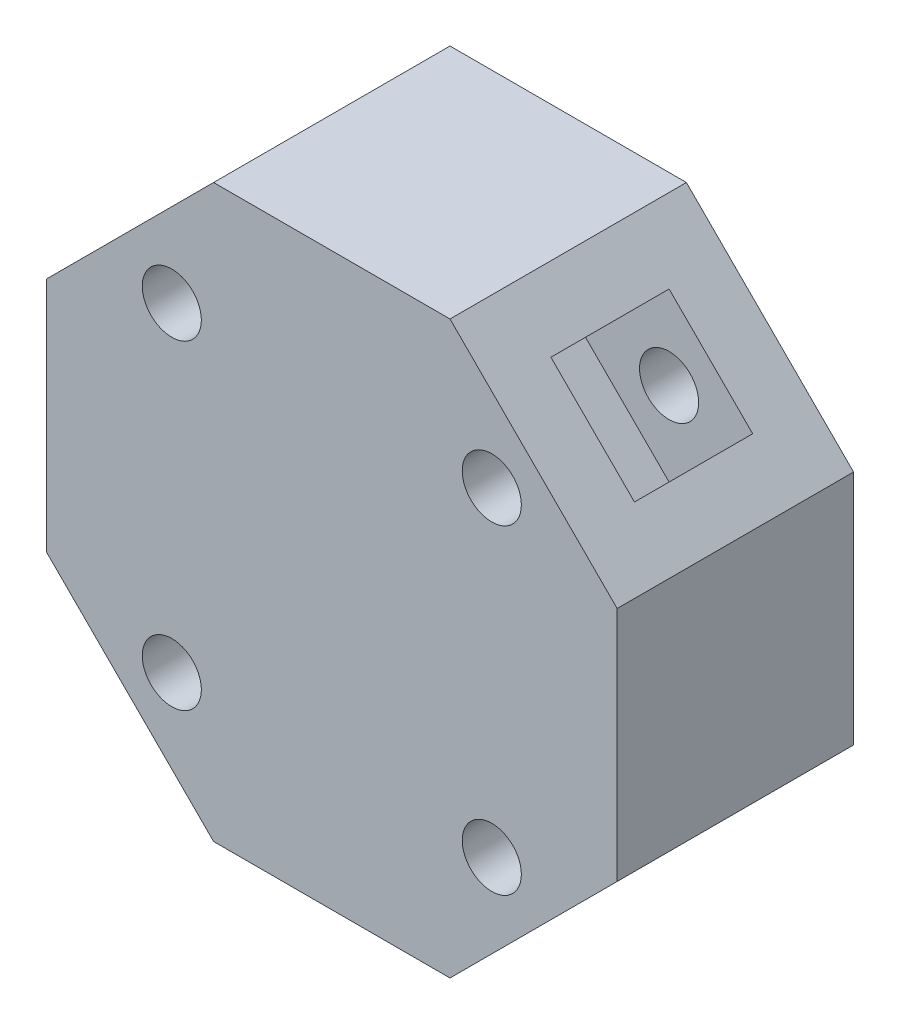
ISO-10303-21;
HEADER;
FILE_DESCRIPTION(('STEP AP214'),'2;1');
FILE_NAME('part.step','',(''),(''),'','','');
FILE_SCHEMA(('AUTOMOTIVE_DESIGN { 1 0 10303 214 1 1 1 1 }'));
ENDSEC;
DATA;
#1=APPLICATION_CONTEXT('core data for automotive mechanical design processes');
#2=APPLICATION_PROTOCOL_DEFINITION('international standard','automotive_design',2000,#1);
#3=PRODUCT_CONTEXT('',#1,'mechanical');
#4=PRODUCT('Part','Part','',(#3));
#5=PRODUCT_RELATED_PRODUCT_CATEGORY('part','',(#4));
#6=PRODUCT_DEFINITION_FORMATION('','',#4);
#7=PRODUCT_DEFINITION_CONTEXT('part definition',#1,'design');
#8=PRODUCT_DEFINITION('design','',#6,#7);
#9=PRODUCT_DEFINITION_SHAPE('','',#8);
#10=(LENGTH_UNIT() NAMED_UNIT(*) SI_UNIT(.MILLI.,.METRE.));
#11=(NAMED_UNIT(*) PLANE_ANGLE_UNIT() SI_UNIT($,.RADIAN.));
#12=(NAMED_UNIT(*) SI_UNIT($,.STERADIAN.) SOLID_ANGLE_UNIT());
#13=UNCERTAINTY_MEASURE_WITH_UNIT(LENGTH_MEASURE(1.E-05),#10,'distance_accuracy_value','');
#14=(GEOMETRIC_REPRESENTATION_CONTEXT(3) GLOBAL_UNCERTAINTY_ASSIGNED_CONTEXT((#13)) GLOBAL_UNIT_ASSIGNED_CONTEXT((#10,
#11,#12)) REPRESENTATION_CONTEXT('',''));
#15=CARTESIAN_POINT('',(0.,0.,0.));
#16=DIRECTION('',(0.,0.,1.));
#17=DIRECTION('',(1.,0.,0.));
#18=AXIS2_PLACEMENT_3D('',#15,#16,#17);
#19=CARTESIAN_POINT('',(12.7,-30.6605122421383,25.4));
#20=DIRECTION('',(-0.707106781186547,0.707106781186548,0.));
#21=DIRECTION('',(-0.707106781186548,-0.707106781186547,0.));
#22=AXIS2_PLACEMENT_3D('',#19,#20,#21);
#23=PLANE('',#22);
#24=DIRECTION('',(0.707106781186548,0.707106781186547,0.));
#25=VECTOR('',#24,1.);
#26=CARTESIAN_POINT('',(12.7,-30.6605122421383,0.));
#27=LINE('',#26,#25);
#28=CARTESIAN_POINT('',(12.7,-30.6605122421383,0.));
#29=VERTEX_POINT('',#28);
#30=CARTESIAN_POINT('',(30.6605122421383,-12.7,0.));
#31=VERTEX_POINT('',#30);
#32=EDGE_CURVE('E354',#29,#31,#27,.T.);
#33=ORIENTED_EDGE('',*,*,#32,.T.);
#34=DIRECTION('',(0.,0.,-1.));
#35=VECTOR('',#34,1.);
#36=CARTESIAN_POINT('',(30.6605122421383,-12.7,25.4));
#37=LINE('',#36,#35);
#38=CARTESIAN_POINT('',(30.6605122421383,-12.7,25.4));
#39=VERTEX_POINT('',#38);
#40=EDGE_CURVE('E379',#39,#31,#37,.T.);
#41=ORIENTED_EDGE('',*,*,#40,.F.);
#42=DIRECTION('',(0.707106781186548,0.707106781186547,0.));
#43=VECTOR('',#42,1.);
#44=CARTESIAN_POINT('',(12.7,-30.6605122421383,25.4));
#45=LINE('',#44,#43);
#46=CARTESIAN_POINT('',(12.7,-30.6605122421383,25.4));
#47=VERTEX_POINT('',#46);
#48=EDGE_CURVE('E337',#47,#39,#45,.T.);
#49=ORIENTED_EDGE('',*,*,#48,.F.);
#50=DIRECTION('',(0.,0.,-1.));
#51=VECTOR('',#50,1.);
#52=CARTESIAN_POINT('',(12.7,-30.6605122421383,25.4));
#53=LINE('',#52,#51);
#54=EDGE_CURVE('E42',#47,#29,#53,.T.);
#55=ORIENTED_EDGE('',*,*,#54,.T.);
#56=EDGE_LOOP('',(#33,#41,#49,#55));
#57=FACE_BOUND('',#56,.T.);
#58=DIRECTION('',(0.707106781186547,0.707106781186548,0.));
#59=VECTOR('',#58,1.);
#60=CARTESIAN_POINT('',(26.1703841816038,-17.1901280605346,19.05));
#61=LINE('',#60,#59);
#62=CARTESIAN_POINT('',(17.1901280605346,-26.1703841816037,19.05));
#63=VERTEX_POINT('',#62);
#64=CARTESIAN_POINT('',(26.1703841816038,-17.1901280605346,19.05));
#65=VERTEX_POINT('',#64);
#66=EDGE_CURVE('E50',#63,#65,#61,.T.);
#67=ORIENTED_EDGE('',*,*,#66,.T.);
#68=DIRECTION('',(0.,0.,-1.));
#69=VECTOR('',#68,1.);
#70=CARTESIAN_POINT('',(26.1703841816038,-17.1901280605346,6.35));
#71=LINE('',#70,#69);
#72=CARTESIAN_POINT('',(26.1703841816038,-17.1901280605346,6.35));
#73=VERTEX_POINT('',#72);
#74=EDGE_CURVE('E216',#65,#73,#71,.T.);
#75=ORIENTED_EDGE('',*,*,#74,.T.);
#76=DIRECTION('',(-0.707106781186547,-0.707106781186548,0.));
#77=VECTOR('',#76,1.);
#78=CARTESIAN_POINT('',(26.1703841816038,-17.1901280605346,6.35));
#79=LINE('',#78,#77);
#80=CARTESIAN_POINT('',(17.1901280605346,-26.1703841816038,6.35));
#81=VERTEX_POINT('',#80);
#82=EDGE_CURVE('E219',#73,#81,#79,.T.);
#83=ORIENTED_EDGE('',*,*,#82,.T.);
#84=DIRECTION('',(0.,0.,1.));
#85=VECTOR('',#84,1.);
#86=CARTESIAN_POINT('',(17.1901280605346,-26.1703841816038,6.35));
#87=LINE('',#86,#85);
#88=EDGE_CURVE('E228',#81,#63,#87,.T.);
#89=ORIENTED_EDGE('',*,*,#88,.T.);
#90=EDGE_LOOP('',(#67,#75,#83,#89));
#91=FACE_BOUND('',#90,.T.);
#92=ADVANCED_FACE('F33',(#57,#91),#23,.F.);
#93=CARTESIAN_POINT('',(-12.7,30.6605122421383,25.4));
#94=DIRECTION('',(0.707106781186547,-0.707106781186548,0.));
#95=DIRECTION('',(0.707106781186548,0.707106781186547,0.));
#96=AXIS2_PLACEMENT_3D('',#93,#94,#95);
#97=PLANE('',#96);
#98=DIRECTION('',(-0.707106781186548,-0.707106781186547,0.));
#99=VECTOR('',#98,1.);
#100=CARTESIAN_POINT('',(-12.7,30.6605122421383,0.));
#101=LINE('',#100,#99);
#102=CARTESIAN_POINT('',(-12.7,30.6605122421383,0.));
#103=VERTEX_POINT('',#102);
#104=CARTESIAN_POINT('',(-30.6605122421383,12.7,0.));
#105=VERTEX_POINT('',#104);
#106=EDGE_CURVE('E362',#103,#105,#101,.T.);
#107=ORIENTED_EDGE('',*,*,#106,.T.);
#108=DIRECTION('',(0.,0.,-1.));
#109=VECTOR('',#108,1.);
#110=CARTESIAN_POINT('',(-30.6605122421383,12.7,25.4));
#111=LINE('',#110,#109);
#112=CARTESIAN_POINT('',(-30.6605122421383,12.7,25.4));
#113=VERTEX_POINT('',#112);
#114=EDGE_CURVE('E367',#113,#105,#111,.T.);
#115=ORIENTED_EDGE('',*,*,#114,.F.);
#116=DIRECTION('',(-0.707106781186548,-0.707106781186547,0.));
#117=VECTOR('',#116,1.);
#118=CARTESIAN_POINT('',(-12.7,30.6605122421383,25.4));
#119=LINE('',#118,#117);
#120=CARTESIAN_POINT('',(-12.7,30.6605122421383,25.4));
#121=VERTEX_POINT('',#120);
#122=EDGE_CURVE('E345',#121,#113,#119,.T.);
#123=ORIENTED_EDGE('',*,*,#122,.F.);
#124=DIRECTION('',(0.,0.,-1.));
#125=VECTOR('',#124,1.);
#126=CARTESIAN_POINT('',(-12.7,30.6605122421383,25.4));
#127=LINE('',#126,#125);
#128=EDGE_CURVE('E370',#121,#103,#127,.T.);
#129=ORIENTED_EDGE('',*,*,#128,.T.);
#130=EDGE_LOOP('',(#107,#115,#123,#129));
#131=FACE_BOUND('',#130,.T.);
#132=DIRECTION('',(-0.707106781186548,-0.707106781186547,0.));
#133=VECTOR('',#132,1.);
#134=CARTESIAN_POINT('',(-26.1703841816038,17.1901280605346,19.05));
#135=LINE('',#134,#133);
#136=CARTESIAN_POINT('',(-17.1901280605346,26.1703841816038,19.05));
#137=VERTEX_POINT('',#136);
#138=CARTESIAN_POINT('',(-26.1703841816038,17.1901280605346,19.05));
#139=VERTEX_POINT('',#138);
#140=EDGE_CURVE('E262',#137,#139,#135,.T.);
#141=ORIENTED_EDGE('',*,*,#140,.T.);
#142=DIRECTION('',(0.,0.,-1.));
#143=VECTOR('',#142,1.);
#144=CARTESIAN_POINT('',(-26.1703841816038,17.1901280605346,6.35));
#145=LINE('',#144,#143);
#146=CARTESIAN_POINT('',(-26.1703841816038,17.1901280605346,6.35));
#147=VERTEX_POINT('',#146);
#148=EDGE_CURVE('E272',#139,#147,#145,.T.);
#149=ORIENTED_EDGE('',*,*,#148,.T.);
#150=DIRECTION('',(0.707106781186548,0.707106781186547,0.));
#151=VECTOR('',#150,1.);
#152=CARTESIAN_POINT('',(-26.1703841816038,17.1901280605346,6.35));
#153=LINE('',#152,#151);
#154=CARTESIAN_POINT('',(-17.1901280605346,26.1703841816038,6.35));
#155=VERTEX_POINT('',#154);
#156=EDGE_CURVE('E284',#147,#155,#153,.T.);
#157=ORIENTED_EDGE('',*,*,#156,.T.);
#158=DIRECTION('',(0.,0.,1.));
#159=VECTOR('',#158,1.);
#160=CARTESIAN_POINT('',(-17.1901280605346,26.1703841816038,6.35));
#161=LINE('',#160,#159);
#162=EDGE_CURVE('E281',#155,#137,#161,.T.);
#163=ORIENTED_EDGE('',*,*,#162,.T.);
#164=EDGE_LOOP('',(#141,#149,#157,#163));
#165=FACE_BOUND('',#164,.T.);
#166=ADVANCED_FACE('F464',(#131,#165),#97,.F.);
#167=CARTESIAN_POINT('',(-30.6605122421384,-12.7,25.4));
#168=DIRECTION('',(0.707106781186548,0.707106781186547,0.));
#169=DIRECTION('',(-0.707106781186547,0.707106781186548,0.));
#170=AXIS2_PLACEMENT_3D('',#167,#168,#169);
#171=PLANE('',#170);
#172=DIRECTION('',(0.,0.,-1.));
#173=VECTOR('',#172,1.);
#174=CARTESIAN_POINT('',(-26.1703841816038,-17.1901280605346,6.35));
#175=LINE('',#174,#173);
#176=CARTESIAN_POINT('',(-26.1703841816037,-17.1901280605346,19.05));
#177=VERTEX_POINT('',#176);
#178=CARTESIAN_POINT('',(-26.1703841816038,-17.1901280605346,6.35));
#179=VERTEX_POINT('',#178);
#180=EDGE_CURVE('E252',#177,#179,#175,.T.);
#181=ORIENTED_EDGE('',*,*,#180,.F.);
#182=DIRECTION('',(-0.707106781186548,0.707106781186547,0.));
#183=VECTOR('',#182,1.);
#184=CARTESIAN_POINT('',(-26.1703841816038,-17.1901280605346,19.05));
#185=LINE('',#184,#183);
#186=CARTESIAN_POINT('',(-17.1901280605346,-26.1703841816038,19.05));
#187=VERTEX_POINT('',#186);
#188=EDGE_CURVE('E58',#187,#177,#185,.T.);
#189=ORIENTED_EDGE('',*,*,#188,.F.);
#190=DIRECTION('',(0.,0.,1.));
#191=VECTOR('',#190,1.);
#192=CARTESIAN_POINT('',(-17.1901280605346,-26.1703841816038,6.35));
#193=LINE('',#192,#191);
#194=CARTESIAN_POINT('',(-17.1901280605346,-26.1703841816038,6.35));
#195=VERTEX_POINT('',#194);
#196=EDGE_CURVE('E241',#195,#187,#193,.T.);
#197=ORIENTED_EDGE('',*,*,#196,.F.);
#198=DIRECTION('',(0.707106781186548,-0.707106781186547,0.));
#199=VECTOR('',#198,1.);
#200=CARTESIAN_POINT('',(-26.1703841816038,-17.1901280605346,6.35));
#201=LINE('',#200,#199);
#202=EDGE_CURVE('E255',#179,#195,#201,.T.);
#203=ORIENTED_EDGE('',*,*,#202,.F.);
#204=EDGE_LOOP('',(#181,#189,#197,#203));
#205=FACE_BOUND('',#204,.T.);
#206=DIRECTION('',(0.707106781186547,-0.707106781186548,0.));
#207=VECTOR('',#206,1.);
#208=CARTESIAN_POINT('',(-30.6605122421384,-12.7,0.));
#209=LINE('',#208,#207);
#210=CARTESIAN_POINT('',(-30.6605122421384,-12.7,0.));
#211=VERTEX_POINT('',#210);
#212=CARTESIAN_POINT('',(-12.7,-30.6605122421383,0.));
#213=VERTEX_POINT('',#212);
#214=EDGE_CURVE('E324',#211,#213,#209,.T.);
#215=ORIENTED_EDGE('',*,*,#214,.T.);
#216=DIRECTION('',(0.,0.,-1.));
#217=VECTOR('',#216,1.);
#218=CARTESIAN_POINT('',(-12.7,-30.6605122421383,25.4));
#219=LINE('',#218,#217);
#220=CARTESIAN_POINT('',(-12.7,-30.6605122421383,25.4));
#221=VERTEX_POINT('',#220);
#222=EDGE_CURVE('E11',#221,#213,#219,.T.);
#223=ORIENTED_EDGE('',*,*,#222,.F.);
#224=DIRECTION('',(0.707106781186547,-0.707106781186548,0.));
#225=VECTOR('',#224,1.);
#226=CARTESIAN_POINT('',(-30.6605122421384,-12.7,25.4));
#227=LINE('',#226,#225);
#228=CARTESIAN_POINT('',(-30.6605122421384,-12.7,25.4));
#229=VERTEX_POINT('',#228);
#230=EDGE_CURVE('E331',#229,#221,#227,.T.);
#231=ORIENTED_EDGE('',*,*,#230,.F.);
#232=DIRECTION('',(0.,0.,-1.));
#233=VECTOR('',#232,1.);
#234=CARTESIAN_POINT('',(-30.6605122421384,-12.7,25.4));
#235=LINE('',#234,#233);
#236=EDGE_CURVE('E349',#229,#211,#235,.T.);
#237=ORIENTED_EDGE('',*,*,#236,.T.);
#238=EDGE_LOOP('',(#215,#223,#231,#237));
#239=FACE_BOUND('',#238,.T.);
#240=ADVANCED_FACE('F35',(#205,#239),#171,.F.);
#241=CARTESIAN_POINT('',(-12.7,-30.6605122421383,25.4));
#242=DIRECTION('',(0.,1.,0.));
#243=DIRECTION('',(-1.,0.,0.));
#244=AXIS2_PLACEMENT_3D('',#241,#242,#243);
#245=PLANE('',#244);
#246=DIRECTION('',(1.,0.,0.));
#247=VECTOR('',#246,1.);
#248=CARTESIAN_POINT('',(-12.7,-30.6605122421383,0.));
#249=LINE('',#248,#247);
#250=EDGE_CURVE('E352',#213,#29,#249,.T.);
#251=ORIENTED_EDGE('',*,*,#250,.T.);
#252=ORIENTED_EDGE('',*,*,#54,.F.);
#253=DIRECTION('',(1.,0.,0.));
#254=VECTOR('',#253,1.);
#255=CARTESIAN_POINT('',(-12.7,-30.6605122421383,25.4));
#256=LINE('',#255,#254);
#257=EDGE_CURVE('E334',#221,#47,#256,.T.);
#258=ORIENTED_EDGE('',*,*,#257,.F.);
#259=ORIENTED_EDGE('',*,*,#222,.T.);
#260=EDGE_LOOP('',(#251,#252,#258,#259));
#261=FACE_BOUND('',#260,.T.);
#262=ADVANCED_FACE('F440',(#261),#245,.F.);
#263=CARTESIAN_POINT('',(30.6605122421383,-12.7,25.4));
#264=DIRECTION('',(-1.,0.,0.));
#265=DIRECTION('',(0.,-1.,0.));
#266=AXIS2_PLACEMENT_3D('',#263,#264,#265);
#267=PLANE('',#266);
#268=DIRECTION('',(0.,1.,0.));
#269=VECTOR('',#268,1.);
#270=CARTESIAN_POINT('',(30.6605122421383,-12.7,0.));
#271=LINE('',#270,#269);
#272=CARTESIAN_POINT('',(30.6605122421383,12.7,0.));
#273=VERTEX_POINT('',#272);
#274=EDGE_CURVE('E356',#31,#273,#271,.T.);
#275=ORIENTED_EDGE('',*,*,#274,.T.);
#276=DIRECTION('',(0.,0.,-1.));
#277=VECTOR('',#276,1.);
#278=CARTESIAN_POINT('',(30.6605122421383,12.7,25.4));
#279=LINE('',#278,#277);
#280=CARTESIAN_POINT('',(30.6605122421383,12.7,25.4));
#281=VERTEX_POINT('',#280);
#282=EDGE_CURVE('E376',#281,#273,#279,.T.);
#283=ORIENTED_EDGE('',*,*,#282,.F.);
#284=DIRECTION('',(0.,1.,0.));
#285=VECTOR('',#284,1.);
#286=CARTESIAN_POINT('',(30.6605122421383,-12.7,25.4));
#287=LINE('',#286,#285);
#288=EDGE_CURVE('E339',#39,#281,#287,.T.);
#289=ORIENTED_EDGE('',*,*,#288,.F.);
#290=ORIENTED_EDGE('',*,*,#40,.T.);
#291=EDGE_LOOP('',(#275,#283,#289,#290));
#292=FACE_BOUND('',#291,.T.);
#293=ADVANCED_FACE('F451',(#292),#267,.F.);
#294=CARTESIAN_POINT('',(30.6605122421383,12.7,25.4));
#295=DIRECTION('',(-0.707106781186548,-0.707106781186547,0.));
#296=DIRECTION('',(0.707106781186547,-0.707106781186548,0.));
#297=AXIS2_PLACEMENT_3D('',#294,#295,#296);
#298=PLANE('',#297);
#299=DIRECTION('',(0.,0.,-1.));
#300=VECTOR('',#299,1.);
#301=CARTESIAN_POINT('',(26.1703841816038,17.1901280605346,6.35));
#302=LINE('',#301,#300);
#303=CARTESIAN_POINT('',(26.1703841816038,17.1901280605346,19.05));
#304=VERTEX_POINT('',#303);
#305=CARTESIAN_POINT('',(26.1703841816038,17.1901280605346,6.35));
#306=VERTEX_POINT('',#305);
#307=EDGE_CURVE('E314',#304,#306,#302,.T.);
#308=ORIENTED_EDGE('',*,*,#307,.F.);
#309=DIRECTION('',(0.707106781186547,-0.707106781186548,0.));
#310=VECTOR('',#309,1.);
#311=CARTESIAN_POINT('',(26.1703841816038,17.1901280605346,19.05));
#312=LINE('',#311,#310);
#313=CARTESIAN_POINT('',(17.1901280605346,26.1703841816038,19.05));
#314=VERTEX_POINT('',#313);
#315=EDGE_CURVE('E292',#314,#304,#312,.T.);
#316=ORIENTED_EDGE('',*,*,#315,.F.);
#317=DIRECTION('',(0.,0.,1.));
#318=VECTOR('',#317,1.);
#319=CARTESIAN_POINT('',(17.1901280605346,26.1703841816038,6.35));
#320=LINE('',#319,#318);
#321=CARTESIAN_POINT('',(17.1901280605346,26.1703841816038,6.35));
#322=VERTEX_POINT('',#321);
#323=EDGE_CURVE('E303',#322,#314,#320,.T.);
#324=ORIENTED_EDGE('',*,*,#323,.F.);
#325=DIRECTION('',(-0.707106781186547,0.707106781186548,0.));
#326=VECTOR('',#325,1.);
#327=CARTESIAN_POINT('',(26.1703841816038,17.1901280605346,6.35));
#328=LINE('',#327,#326);
#329=EDGE_CURVE('E317',#306,#322,#328,.T.);
#330=ORIENTED_EDGE('',*,*,#329,.F.);
#331=EDGE_LOOP('',(#308,#316,#324,#330));
#332=FACE_BOUND('',#331,.T.);
#333=DIRECTION('',(-0.707106781186547,0.707106781186548,0.));
#334=VECTOR('',#333,1.);
#335=CARTESIAN_POINT('',(30.6605122421383,12.7,0.));
#336=LINE('',#335,#334);
#337=CARTESIAN_POINT('',(12.7,30.6605122421384,0.));
#338=VERTEX_POINT('',#337);
#339=EDGE_CURVE('E358',#273,#338,#336,.T.);
#340=ORIENTED_EDGE('',*,*,#339,.T.);
#341=DIRECTION('',(0.,0.,-1.));
#342=VECTOR('',#341,1.);
#343=CARTESIAN_POINT('',(12.7,30.6605122421384,25.4));
#344=LINE('',#343,#342);
#345=CARTESIAN_POINT('',(12.7,30.6605122421384,25.4));
#346=VERTEX_POINT('',#345);
#347=EDGE_CURVE('E373',#346,#338,#344,.T.);
#348=ORIENTED_EDGE('',*,*,#347,.F.);
#349=DIRECTION('',(-0.707106781186547,0.707106781186548,0.));
#350=VECTOR('',#349,1.);
#351=CARTESIAN_POINT('',(30.6605122421383,12.7,25.4));
#352=LINE('',#351,#350);
#353=EDGE_CURVE('E341',#281,#346,#352,.T.);
#354=ORIENTED_EDGE('',*,*,#353,.F.);
#355=ORIENTED_EDGE('',*,*,#282,.T.);
#356=EDGE_LOOP('',(#340,#348,#354,#355));
#357=FACE_BOUND('',#356,.T.);
#358=ADVANCED_FACE('F455',(#332,#357),#298,.F.);
#359=CARTESIAN_POINT('',(12.7,30.6605122421384,25.4));
#360=DIRECTION('',(0.,-1.,0.));
#361=DIRECTION('',(1.,0.,0.));
#362=AXIS2_PLACEMENT_3D('',#359,#360,#361);
#363=PLANE('',#362);
#364=DIRECTION('',(-1.,0.,0.));
#365=VECTOR('',#364,1.);
#366=CARTESIAN_POINT('',(12.7,30.6605122421384,0.));
#367=LINE('',#366,#365);
#368=EDGE_CURVE('E360',#338,#103,#367,.T.);
#369=ORIENTED_EDGE('',*,*,#368,.T.);
#370=ORIENTED_EDGE('',*,*,#128,.F.);
#371=DIRECTION('',(-1.,0.,0.));
#372=VECTOR('',#371,1.);
#373=CARTESIAN_POINT('',(12.7,30.6605122421384,25.4));
#374=LINE('',#373,#372);
#375=EDGE_CURVE('E343',#346,#121,#374,.T.);
#376=ORIENTED_EDGE('',*,*,#375,.F.);
#377=ORIENTED_EDGE('',*,*,#347,.T.);
#378=EDGE_LOOP('',(#369,#370,#376,#377));
#379=FACE_BOUND('',#378,.T.);
#380=ADVANCED_FACE('F460',(#379),#363,.F.);
#381=CARTESIAN_POINT('',(-30.6605122421383,12.7,25.4));
#382=DIRECTION('',(1.,0.,0.));
#383=DIRECTION('',(0.,1.,0.));
#384=AXIS2_PLACEMENT_3D('',#381,#382,#383);
#385=PLANE('',#384);
#386=DIRECTION('',(0.,-1.,0.));
#387=VECTOR('',#386,1.);
#388=CARTESIAN_POINT('',(-30.6605122421383,12.7,0.));
#389=LINE('',#388,#387);
#390=EDGE_CURVE('E335',#105,#211,#389,.T.);
#391=ORIENTED_EDGE('',*,*,#390,.T.);
#392=ORIENTED_EDGE('',*,*,#236,.F.);
#393=DIRECTION('',(0.,-1.,0.));
#394=VECTOR('',#393,1.);
#395=CARTESIAN_POINT('',(-30.6605122421383,12.7,25.4));
#396=LINE('',#395,#394);
#397=EDGE_CURVE('E347',#113,#229,#396,.T.);
#398=ORIENTED_EDGE('',*,*,#397,.F.);
#399=ORIENTED_EDGE('',*,*,#114,.T.);
#400=EDGE_LOOP('',(#391,#392,#398,#399));
#401=FACE_BOUND('',#400,.T.);
#402=ADVANCED_FACE('F429',(#401),#385,.F.);
#403=CARTESIAN_POINT('',(0.,0.,25.4));
#404=DIRECTION('',(0.,0.,1.));
#405=DIRECTION('',(1.,0.,0.));
#406=AXIS2_PLACEMENT_3D('',#403,#404,#405);
#407=PLANE('',#406);
#408=CARTESIAN_POINT('',(17.1901280605346,17.1901280605346,25.4));
#409=DIRECTION('',(0.,0.,1.));
#410=DIRECTION('',(-1.,0.,0.));
#411=AXIS2_PLACEMENT_3D('',#408,#409,#410);
#412=CIRCLE('',#411,3.175);
#413=CARTESIAN_POINT('',(14.0151280605346,17.1901280605346,25.4));
#414=VERTEX_POINT('',#413);
#415=EDGE_CURVE('E843',#414,#414,#412,.T.);
#416=ORIENTED_EDGE('',*,*,#415,.F.);
#417=EDGE_LOOP('',(#416));
#418=FACE_BOUND('',#417,.T.);
#419=CARTESIAN_POINT('',(17.1901280605346,-17.1901280605346,25.4));
#420=DIRECTION('',(0.,0.,1.));
#421=DIRECTION('',(1.,0.,0.));
#422=AXIS2_PLACEMENT_3D('',#419,#420,#421);
#423=CIRCLE('',#422,3.17500000000001);
#424=CARTESIAN_POINT('',(20.3651280605346,-17.1901280605346,25.4));
#425=VERTEX_POINT('',#424);
#426=EDGE_CURVE('E402',#425,#425,#423,.T.);
#427=ORIENTED_EDGE('',*,*,#426,.F.);
#428=EDGE_LOOP('',(#427));
#429=FACE_BOUND('',#428,.T.);
#430=CARTESIAN_POINT('',(-17.1901280605346,-17.1901280605346,25.4));
#431=DIRECTION('',(0.,0.,1.));
#432=DIRECTION('',(-1.,0.,0.));
#433=AXIS2_PLACEMENT_3D('',#430,#431,#432);
#434=CIRCLE('',#433,3.175);
#435=CARTESIAN_POINT('',(-20.3651280605346,-17.1901280605346,25.4));
#436=VERTEX_POINT('',#435);
#437=EDGE_CURVE('E399',#436,#436,#434,.T.);
#438=ORIENTED_EDGE('',*,*,#437,.F.);
#439=EDGE_LOOP('',(#438));
#440=FACE_BOUND('',#439,.T.);
#441=CARTESIAN_POINT('',(-17.1901280605346,17.1901280605346,25.4));
#442=DIRECTION('',(0.,0.,1.));
#443=DIRECTION('',(1.,0.,0.));
#444=AXIS2_PLACEMENT_3D('',#441,#442,#443);
#445=CIRCLE('',#444,3.175);
#446=CARTESIAN_POINT('',(-14.0151280605346,17.1901280605346,25.4));
#447=VERTEX_POINT('',#446);
#448=EDGE_CURVE('E418',#447,#447,#445,.T.);
#449=ORIENTED_EDGE('',*,*,#448,.F.);
#450=EDGE_LOOP('',(#449));
#451=FACE_BOUND('',#450,.T.);
#452=ORIENTED_EDGE('',*,*,#230,.T.);
#453=ORIENTED_EDGE('',*,*,#257,.T.);
#454=ORIENTED_EDGE('',*,*,#48,.T.);
#455=ORIENTED_EDGE('',*,*,#288,.T.);
#456=ORIENTED_EDGE('',*,*,#353,.T.);
#457=ORIENTED_EDGE('',*,*,#375,.T.);
#458=ORIENTED_EDGE('',*,*,#122,.T.);
#459=ORIENTED_EDGE('',*,*,#397,.T.);
#460=EDGE_LOOP('',(#452,#453,#454,#455,#456,#457,#458,#459));
#461=FACE_BOUND('',#460,.T.);
#462=ADVANCED_FACE('F425',(#418,#429,#440,#451,#461),#407,.T.);
#463=CARTESIAN_POINT('',(0.,0.,0.));
#464=DIRECTION('',(0.,0.,1.));
#465=DIRECTION('',(1.,0.,0.));
#466=AXIS2_PLACEMENT_3D('',#463,#464,#465);
#467=PLANE('',#466);
#468=CARTESIAN_POINT('',(17.1901280605346,17.1901280605346,0.));
#469=DIRECTION('',(0.,0.,1.));
#470=DIRECTION('',(-1.,0.,0.));
#471=AXIS2_PLACEMENT_3D('',#468,#469,#470);
#472=CIRCLE('',#471,3.175);
#473=CARTESIAN_POINT('',(14.0151280605346,17.1901280605346,0.));
#474=VERTEX_POINT('',#473);
#475=EDGE_CURVE('E847',#474,#474,#472,.T.);
#476=ORIENTED_EDGE('',*,*,#475,.T.);
#477=EDGE_LOOP('',(#476));
#478=FACE_BOUND('',#477,.T.);
#479=CARTESIAN_POINT('',(17.1901280605346,-17.1901280605346,0.));
#480=DIRECTION('',(0.,0.,1.));
#481=DIRECTION('',(1.,0.,0.));
#482=AXIS2_PLACEMENT_3D('',#479,#480,#481);
#483=CIRCLE('',#482,3.17500000000001);
#484=CARTESIAN_POINT('',(20.3651280605346,-17.1901280605346,0.));
#485=VERTEX_POINT('',#484);
#486=EDGE_CURVE('E395',#485,#485,#483,.T.);
#487=ORIENTED_EDGE('',*,*,#486,.T.);
#488=EDGE_LOOP('',(#487));
#489=FACE_BOUND('',#488,.T.);
#490=CARTESIAN_POINT('',(-17.1901280605346,-17.1901280605346,0.));
#491=DIRECTION('',(0.,0.,1.));
#492=DIRECTION('',(-1.,0.,0.));
#493=AXIS2_PLACEMENT_3D('',#490,#491,#492);
#494=CIRCLE('',#493,3.175);
#495=CARTESIAN_POINT('',(-20.3651280605346,-17.1901280605346,0.));
#496=VERTEX_POINT('',#495);
#497=EDGE_CURVE('E391',#496,#496,#494,.T.);
#498=ORIENTED_EDGE('',*,*,#497,.T.);
#499=EDGE_LOOP('',(#498));
#500=FACE_BOUND('',#499,.T.);
#501=CARTESIAN_POINT('',(-17.1901280605346,17.1901280605346,0.));
#502=DIRECTION('',(0.,0.,1.));
#503=DIRECTION('',(1.,0.,0.));
#504=AXIS2_PLACEMENT_3D('',#501,#502,#503);
#505=CIRCLE('',#504,3.175);
#506=CARTESIAN_POINT('',(-14.0151280605346,17.1901280605346,0.));
#507=VERTEX_POINT('',#506);
#508=EDGE_CURVE('E387',#507,#507,#505,.T.);
#509=ORIENTED_EDGE('',*,*,#508,.T.);
#510=EDGE_LOOP('',(#509));
#511=FACE_BOUND('',#510,.T.);
#512=ORIENTED_EDGE('',*,*,#214,.F.);
#513=ORIENTED_EDGE('',*,*,#390,.F.);
#514=ORIENTED_EDGE('',*,*,#106,.F.);
#515=ORIENTED_EDGE('',*,*,#368,.F.);
#516=ORIENTED_EDGE('',*,*,#339,.F.);
#517=ORIENTED_EDGE('',*,*,#274,.F.);
#518=ORIENTED_EDGE('',*,*,#32,.F.);
#519=ORIENTED_EDGE('',*,*,#250,.F.);
#520=EDGE_LOOP('',(#512,#513,#514,#515,#516,#517,#518,#519));
#521=FACE_BOUND('',#520,.T.);
#522=ADVANCED_FACE('F428',(#478,#489,#500,#511,#521),#467,.F.);
#523=CARTESIAN_POINT('',(17.1901280605346,8.20987193946545,19.05));
#524=DIRECTION('',(0.,0.,1.));
#525=DIRECTION('',(1.,0.,0.));
#526=AXIS2_PLACEMENT_3D('',#523,#524,#525);
#527=PLANE('',#526);
#528=CARTESIAN_POINT('',(17.1901280605346,17.1901280605346,19.05));
#529=DIRECTION('',(0.,0.,1.));
#530=DIRECTION('',(1.,0.,0.));
#531=AXIS2_PLACEMENT_3D('',#528,#529,#530);
#532=CIRCLE('',#531,3.175);
#533=CARTESIAN_POINT('',(20.3651280605346,17.1901280605346,19.05));
#534=VERTEX_POINT('',#533);
#535=EDGE_CURVE('E407',#534,#534,#532,.T.);
#536=ORIENTED_EDGE('',*,*,#535,.T.);
#537=EDGE_LOOP('',(#536));
#538=FACE_BOUND('',#537,.T.);
#539=ORIENTED_EDGE('',*,*,#315,.T.);
#540=DIRECTION('',(0.707106781186548,0.707106781186547,0.));
#541=VECTOR('',#540,1.);
#542=CARTESIAN_POINT('',(17.1901280605346,8.20987193946545,19.05));
#543=LINE('',#542,#541);
#544=CARTESIAN_POINT('',(17.1901280605346,8.20987193946545,19.05));
#545=VERTEX_POINT('',#544);
#546=EDGE_CURVE('E312',#545,#304,#543,.T.);
#547=ORIENTED_EDGE('',*,*,#546,.F.);
#548=DIRECTION('',(0.707106781186547,-0.707106781186548,0.));
#549=VECTOR('',#548,1.);
#550=CARTESIAN_POINT('',(17.1901280605346,8.20987193946545,19.05));
#551=LINE('',#550,#549);
#552=CARTESIAN_POINT('',(8.20987193946547,17.1901280605346,19.05));
#553=VERTEX_POINT('',#552);
#554=EDGE_CURVE('E299',#553,#545,#551,.T.);
#555=ORIENTED_EDGE('',*,*,#554,.F.);
#556=DIRECTION('',(0.707106781186548,0.707106781186547,0.));
#557=VECTOR('',#556,1.);
#558=CARTESIAN_POINT('',(8.20987193946547,17.1901280605346,19.05));
#559=LINE('',#558,#557);
#560=EDGE_CURVE('E322',#553,#314,#559,.T.);
#561=ORIENTED_EDGE('',*,*,#560,.T.);
#562=EDGE_LOOP('',(#539,#547,#555,#561));
#563=FACE_BOUND('',#562,.T.);
#564=ADVANCED_FACE('F471',(#538,#563),#527,.F.);
#565=CARTESIAN_POINT('',(8.20987193946547,17.1901280605346,6.35));
#566=DIRECTION('',(-0.707106781186547,0.707106781186548,0.));
#567=DIRECTION('',(-0.707106781186548,-0.707106781186547,0.));
#568=AXIS2_PLACEMENT_3D('',#565,#566,#567);
#569=PLANE('',#568);
#570=ORIENTED_EDGE('',*,*,#323,.T.);
#571=ORIENTED_EDGE('',*,*,#560,.F.);
#572=DIRECTION('',(0.,0.,1.));
#573=VECTOR('',#572,1.);
#574=CARTESIAN_POINT('',(8.20987193946547,17.1901280605346,6.35));
#575=LINE('',#574,#573);
#576=CARTESIAN_POINT('',(8.20987193946547,17.1901280605346,6.35));
#577=VERTEX_POINT('',#576);
#578=EDGE_CURVE('E309',#577,#553,#575,.T.);
#579=ORIENTED_EDGE('',*,*,#578,.F.);
#580=DIRECTION('',(0.707106781186548,0.707106781186547,0.));
#581=VECTOR('',#580,1.);
#582=CARTESIAN_POINT('',(8.20987193946547,17.1901280605346,6.35));
#583=LINE('',#582,#581);
#584=EDGE_CURVE('E325',#577,#322,#583,.T.);
#585=ORIENTED_EDGE('',*,*,#584,.T.);
#586=EDGE_LOOP('',(#570,#571,#579,#585));
#587=FACE_BOUND('',#586,.T.);
#588=ADVANCED_FACE('F477',(#587),#569,.F.);
#589=CARTESIAN_POINT('',(17.1901280605346,8.20987193946545,6.35));
#590=DIRECTION('',(0.,0.,-1.));
#591=DIRECTION('',(-1.,0.,0.));
#592=AXIS2_PLACEMENT_3D('',#589,#590,#591);
#593=PLANE('',#592);
#594=CARTESIAN_POINT('',(17.1901280605346,17.1901280605346,6.35));
#595=DIRECTION('',(0.,0.,-1.));
#596=DIRECTION('',(-1.,0.,0.));
#597=AXIS2_PLACEMENT_3D('',#594,#595,#596);
#598=CIRCLE('',#597,3.175);
#599=CARTESIAN_POINT('',(14.0151280605346,17.1901280605346,6.35));
#600=VERTEX_POINT('',#599);
#601=EDGE_CURVE('E37',#600,#600,#598,.T.);
#602=ORIENTED_EDGE('',*,*,#601,.T.);
#603=EDGE_LOOP('',(#602));
#604=FACE_BOUND('',#603,.T.);
#605=ORIENTED_EDGE('',*,*,#329,.T.);
#606=ORIENTED_EDGE('',*,*,#584,.F.);
#607=DIRECTION('',(-0.707106781186547,0.707106781186548,0.));
#608=VECTOR('',#607,1.);
#609=CARTESIAN_POINT('',(17.1901280605346,8.20987193946545,6.35));
#610=LINE('',#609,#608);
#611=CARTESIAN_POINT('',(17.1901280605346,8.20987193946545,6.35));
#612=VERTEX_POINT('',#611);
#613=EDGE_CURVE('E306',#612,#577,#610,.T.);
#614=ORIENTED_EDGE('',*,*,#613,.F.);
#615=DIRECTION('',(0.707106781186548,0.707106781186547,0.));
#616=VECTOR('',#615,1.);
#617=CARTESIAN_POINT('',(17.1901280605346,8.20987193946545,6.35));
#618=LINE('',#617,#616);
#619=EDGE_CURVE('E327',#612,#306,#618,.T.);
#620=ORIENTED_EDGE('',*,*,#619,.T.);
#621=EDGE_LOOP('',(#605,#606,#614,#620));
#622=FACE_BOUND('',#621,.T.);
#623=ADVANCED_FACE('F555',(#604,#622),#593,.F.);
#624=CARTESIAN_POINT('',(17.1901280605346,8.20987193946545,6.35));
#625=DIRECTION('',(0.707106781186547,-0.707106781186548,0.));
#626=DIRECTION('',(0.707106781186548,0.707106781186547,0.));
#627=AXIS2_PLACEMENT_3D('',#624,#625,#626);
#628=PLANE('',#627);
#629=ORIENTED_EDGE('',*,*,#307,.T.);
#630=ORIENTED_EDGE('',*,*,#619,.F.);
#631=DIRECTION('',(0.,0.,-1.));
#632=VECTOR('',#631,1.);
#633=CARTESIAN_POINT('',(17.1901280605346,8.20987193946545,6.35));
#634=LINE('',#633,#632);
#635=EDGE_CURVE('E302',#545,#612,#634,.T.);
#636=ORIENTED_EDGE('',*,*,#635,.F.);
#637=ORIENTED_EDGE('',*,*,#546,.T.);
#638=EDGE_LOOP('',(#629,#630,#636,#637));
#639=FACE_BOUND('',#638,.T.);
#640=ADVANCED_FACE('F551',(#639),#628,.F.);
#641=CARTESIAN_POINT('',(12.7,12.7,0.));
#642=DIRECTION('',(0.707106781186548,0.707106781186547,0.));
#643=DIRECTION('',(-0.707106781186547,0.707106781186548,0.));
#644=AXIS2_PLACEMENT_3D('',#641,#642,#643);
#645=PLANE('',#644);
#646=ORIENTED_EDGE('',*,*,#554,.T.);
#647=ORIENTED_EDGE('',*,*,#635,.T.);
#648=ORIENTED_EDGE('',*,*,#613,.T.);
#649=ORIENTED_EDGE('',*,*,#578,.T.);
#650=EDGE_LOOP('',(#646,#647,#648,#649));
#651=FACE_BOUND('',#650,.T.);
#652=ADVANCED_FACE('F547',(#651),#645,.T.);
#653=CARTESIAN_POINT('',(-17.1901280605346,8.20987193946546,19.05));
#654=DIRECTION('',(0.,0.,-1.));
#655=DIRECTION('',(-1.,0.,0.));
#656=AXIS2_PLACEMENT_3D('',#653,#654,#655);
#657=PLANE('',#656);
#658=CARTESIAN_POINT('',(-17.1901280605346,17.1901280605346,19.05));
#659=DIRECTION('',(0.,0.,-1.));
#660=DIRECTION('',(-1.,0.,0.));
#661=AXIS2_PLACEMENT_3D('',#658,#659,#660);
#662=CIRCLE('',#661,3.175);
#663=CARTESIAN_POINT('',(-20.3651280605346,17.1901280605346,19.05));
#664=VERTEX_POINT('',#663);
#665=EDGE_CURVE('E222',#664,#664,#662,.T.);
#666=ORIENTED_EDGE('',*,*,#665,.F.);
#667=EDGE_LOOP('',(#666));
#668=FACE_BOUND('',#667,.T.);
#669=ORIENTED_EDGE('',*,*,#140,.F.);
#670=DIRECTION('',(-0.707106781186547,0.707106781186548,0.));
#671=VECTOR('',#670,1.);
#672=CARTESIAN_POINT('',(-8.20987193946545,17.1901280605346,19.05));
#673=LINE('',#672,#671);
#674=CARTESIAN_POINT('',(-8.20987193946545,17.1901280605346,19.05));
#675=VERTEX_POINT('',#674);
#676=EDGE_CURVE('E278',#675,#137,#673,.T.);
#677=ORIENTED_EDGE('',*,*,#676,.F.);
#678=DIRECTION('',(-0.707106781186548,-0.707106781186547,0.));
#679=VECTOR('',#678,1.);
#680=CARTESIAN_POINT('',(-17.1901280605346,8.20987193946546,19.05));
#681=LINE('',#680,#679);
#682=CARTESIAN_POINT('',(-17.1901280605346,8.20987193946546,19.05));
#683=VERTEX_POINT('',#682);
#684=EDGE_CURVE('E268',#675,#683,#681,.T.);
#685=ORIENTED_EDGE('',*,*,#684,.T.);
#686=DIRECTION('',(-0.707106781186547,0.707106781186548,0.));
#687=VECTOR('',#686,1.);
#688=CARTESIAN_POINT('',(-17.1901280605346,8.20987193946546,19.05));
#689=LINE('',#688,#687);
#690=EDGE_CURVE('E289',#683,#139,#689,.T.);
#691=ORIENTED_EDGE('',*,*,#690,.T.);
#692=EDGE_LOOP('',(#669,#677,#685,#691));
#693=FACE_BOUND('',#692,.T.);
#694=ADVANCED_FACE('F537',(#668,#693),#657,.T.);
#695=CARTESIAN_POINT('',(-17.1901280605346,8.20987193946546,6.35));
#696=DIRECTION('',(0.707106781186548,0.707106781186547,0.));
#697=DIRECTION('',(-0.707106781186547,0.707106781186548,0.));
#698=AXIS2_PLACEMENT_3D('',#695,#696,#697);
#699=PLANE('',#698);
#700=ORIENTED_EDGE('',*,*,#148,.F.);
#701=ORIENTED_EDGE('',*,*,#690,.F.);
#702=DIRECTION('',(0.,0.,-1.));
#703=VECTOR('',#702,1.);
#704=CARTESIAN_POINT('',(-17.1901280605346,8.20987193946546,6.35));
#705=LINE('',#704,#703);
#706=CARTESIAN_POINT('',(-17.1901280605346,8.20987193946546,6.35));
#707=VERTEX_POINT('',#706);
#708=EDGE_CURVE('E276',#683,#707,#705,.T.);
#709=ORIENTED_EDGE('',*,*,#708,.T.);
#710=DIRECTION('',(-0.707106781186547,0.707106781186548,0.));
#711=VECTOR('',#710,1.);
#712=CARTESIAN_POINT('',(-17.1901280605346,8.20987193946546,6.35));
#713=LINE('',#712,#711);
#714=EDGE_CURVE('E293',#707,#147,#713,.T.);
#715=ORIENTED_EDGE('',*,*,#714,.T.);
#716=EDGE_LOOP('',(#700,#701,#709,#715));
#717=FACE_BOUND('',#716,.T.);
#718=ADVANCED_FACE('F533',(#717),#699,.T.);
#719=CARTESIAN_POINT('',(-17.1901280605346,8.20987193946546,6.35));
#720=DIRECTION('',(0.,0.,1.));
#721=DIRECTION('',(1.,0.,0.));
#722=AXIS2_PLACEMENT_3D('',#719,#720,#721);
#723=PLANE('',#722);
#724=CARTESIAN_POINT('',(-17.1901280605346,17.1901280605346,6.35));
#725=DIRECTION('',(0.,0.,1.));
#726=DIRECTION('',(1.,0.,0.));
#727=AXIS2_PLACEMENT_3D('',#724,#725,#726);
#728=CIRCLE('',#727,3.175);
#729=CARTESIAN_POINT('',(-14.0151280605346,17.1901280605346,6.35));
#730=VERTEX_POINT('',#729);
#731=EDGE_CURVE('E384',#730,#730,#728,.T.);
#732=ORIENTED_EDGE('',*,*,#731,.F.);
#733=EDGE_LOOP('',(#732));
#734=FACE_BOUND('',#733,.T.);
#735=ORIENTED_EDGE('',*,*,#156,.F.);
#736=ORIENTED_EDGE('',*,*,#714,.F.);
#737=DIRECTION('',(0.707106781186548,0.707106781186547,0.));
#738=VECTOR('',#737,1.);
#739=CARTESIAN_POINT('',(-17.1901280605346,8.20987193946546,6.35));
#740=LINE('',#739,#738);
#741=CARTESIAN_POINT('',(-8.20987193946545,17.1901280605346,6.35));
#742=VERTEX_POINT('',#741);
#743=EDGE_CURVE('E274',#707,#742,#740,.T.);
#744=ORIENTED_EDGE('',*,*,#743,.T.);
#745=DIRECTION('',(-0.707106781186547,0.707106781186548,0.));
#746=VECTOR('',#745,1.);
#747=CARTESIAN_POINT('',(-8.20987193946545,17.1901280605346,6.35));
#748=LINE('',#747,#746);
#749=EDGE_CURVE('E295',#742,#155,#748,.T.);
#750=ORIENTED_EDGE('',*,*,#749,.T.);
#751=EDGE_LOOP('',(#735,#736,#744,#750));
#752=FACE_BOUND('',#751,.T.);
#753=ADVANCED_FACE('F536',(#734,#752),#723,.T.);
#754=CARTESIAN_POINT('',(-8.20987193946545,17.1901280605346,6.35));
#755=DIRECTION('',(-0.707106781186548,-0.707106781186547,0.));
#756=DIRECTION('',(0.707106781186547,-0.707106781186548,0.));
#757=AXIS2_PLACEMENT_3D('',#754,#755,#756);
#758=PLANE('',#757);
#759=ORIENTED_EDGE('',*,*,#162,.F.);
#760=ORIENTED_EDGE('',*,*,#749,.F.);
#761=DIRECTION('',(0.,0.,1.));
#762=VECTOR('',#761,1.);
#763=CARTESIAN_POINT('',(-8.20987193946545,17.1901280605346,6.35));
#764=LINE('',#763,#762);
#765=EDGE_CURVE('E271',#742,#675,#764,.T.);
#766=ORIENTED_EDGE('',*,*,#765,.T.);
#767=ORIENTED_EDGE('',*,*,#676,.T.);
#768=EDGE_LOOP('',(#759,#760,#766,#767));
#769=FACE_BOUND('',#768,.T.);
#770=ADVANCED_FACE('F531',(#769),#758,.T.);
#771=CARTESIAN_POINT('',(-12.7,12.7,0.));
#772=DIRECTION('',(-0.707106781186547,0.707106781186548,0.));
#773=DIRECTION('',(0.707106781186548,0.707106781186547,0.));
#774=AXIS2_PLACEMENT_3D('',#771,#772,#773);
#775=PLANE('',#774);
#776=ORIENTED_EDGE('',*,*,#684,.F.);
#777=ORIENTED_EDGE('',*,*,#765,.F.);
#778=ORIENTED_EDGE('',*,*,#743,.F.);
#779=ORIENTED_EDGE('',*,*,#708,.F.);
#780=EDGE_LOOP('',(#776,#777,#778,#779));
#781=FACE_BOUND('',#780,.T.);
#782=ADVANCED_FACE('F527',(#781),#775,.T.);
#783=CARTESIAN_POINT('',(-17.1901280605346,-8.20987193946546,19.05));
#784=DIRECTION('',(0.,0.,1.));
#785=DIRECTION('',(1.,0.,0.));
#786=AXIS2_PLACEMENT_3D('',#783,#784,#785);
#787=PLANE('',#786);
#788=CARTESIAN_POINT('',(-17.1901280605346,-17.1901280605346,19.05));
#789=DIRECTION('',(0.,0.,1.));
#790=DIRECTION('',(1.,0.,0.));
#791=AXIS2_PLACEMENT_3D('',#788,#789,#790);
#792=CIRCLE('',#791,3.175);
#793=CARTESIAN_POINT('',(-14.0151280605346,-17.1901280605346,19.05));
#794=VERTEX_POINT('',#793);
#795=EDGE_CURVE('E390',#794,#794,#792,.T.);
#796=ORIENTED_EDGE('',*,*,#795,.T.);
#797=EDGE_LOOP('',(#796));
#798=FACE_BOUND('',#797,.T.);
#799=ORIENTED_EDGE('',*,*,#188,.T.);
#800=DIRECTION('',(-0.707106781186547,-0.707106781186548,0.));
#801=VECTOR('',#800,1.);
#802=CARTESIAN_POINT('',(-17.1901280605346,-8.20987193946546,19.05));
#803=LINE('',#802,#801);
#804=CARTESIAN_POINT('',(-17.1901280605346,-8.20987193946546,19.05));
#805=VERTEX_POINT('',#804);
#806=EDGE_CURVE('E250',#805,#177,#803,.T.);
#807=ORIENTED_EDGE('',*,*,#806,.F.);
#808=DIRECTION('',(-0.707106781186548,0.707106781186547,0.));
#809=VECTOR('',#808,1.);
#810=CARTESIAN_POINT('',(-17.1901280605346,-8.20987193946546,19.05));
#811=LINE('',#810,#809);
#812=CARTESIAN_POINT('',(-8.20987193946545,-17.1901280605346,19.05));
#813=VERTEX_POINT('',#812);
#814=EDGE_CURVE('E237',#813,#805,#811,.T.);
#815=ORIENTED_EDGE('',*,*,#814,.F.);
#816=DIRECTION('',(-0.707106781186547,-0.707106781186548,0.));
#817=VECTOR('',#816,1.);
#818=CARTESIAN_POINT('',(-8.20987193946545,-17.1901280605346,19.05));
#819=LINE('',#818,#817);
#820=EDGE_CURVE('E260',#813,#187,#819,.T.);
#821=ORIENTED_EDGE('',*,*,#820,.T.);
#822=EDGE_LOOP('',(#799,#807,#815,#821));
#823=FACE_BOUND('',#822,.T.);
#824=ADVANCED_FACE('F506',(#798,#823),#787,.F.);
#825=CARTESIAN_POINT('',(-8.20987193946545,-17.1901280605346,6.35));
#826=DIRECTION('',(0.707106781186548,-0.707106781186547,0.));
#827=DIRECTION('',(0.707106781186547,0.707106781186548,0.));
#828=AXIS2_PLACEMENT_3D('',#825,#826,#827);
#829=PLANE('',#828);
#830=ORIENTED_EDGE('',*,*,#196,.T.);
#831=ORIENTED_EDGE('',*,*,#820,.F.);
#832=DIRECTION('',(0.,0.,1.));
#833=VECTOR('',#832,1.);
#834=CARTESIAN_POINT('',(-8.20987193946545,-17.1901280605346,6.35));
#835=LINE('',#834,#833);
#836=CARTESIAN_POINT('',(-8.20987193946545,-17.1901280605346,6.35));
#837=VERTEX_POINT('',#836);
#838=EDGE_CURVE('E247',#837,#813,#835,.T.);
#839=ORIENTED_EDGE('',*,*,#838,.F.);
#840=DIRECTION('',(-0.707106781186547,-0.707106781186548,0.));
#841=VECTOR('',#840,1.);
#842=CARTESIAN_POINT('',(-8.20987193946545,-17.1901280605346,6.35));
#843=LINE('',#842,#841);
#844=EDGE_CURVE('E263',#837,#195,#843,.T.);
#845=ORIENTED_EDGE('',*,*,#844,.T.);
#846=EDGE_LOOP('',(#830,#831,#839,#845));
#847=FACE_BOUND('',#846,.T.);
#848=ADVANCED_FACE('F511',(#847),#829,.F.);
#849=CARTESIAN_POINT('',(-17.1901280605346,-8.20987193946546,6.35));
#850=DIRECTION('',(0.,0.,-1.));
#851=DIRECTION('',(-1.,0.,0.));
#852=AXIS2_PLACEMENT_3D('',#849,#850,#851);
#853=PLANE('',#852);
#854=CARTESIAN_POINT('',(-17.1901280605346,-17.1901280605346,6.35));
#855=DIRECTION('',(0.,0.,-1.));
#856=DIRECTION('',(-1.,0.,0.));
#857=AXIS2_PLACEMENT_3D('',#854,#855,#856);
#858=CIRCLE('',#857,3.175);
#859=CARTESIAN_POINT('',(-20.3651280605346,-17.1901280605346,6.35));
#860=VERTEX_POINT('',#859);
#861=EDGE_CURVE('E388',#860,#860,#858,.T.);
#862=ORIENTED_EDGE('',*,*,#861,.T.);
#863=EDGE_LOOP('',(#862));
#864=FACE_BOUND('',#863,.T.);
#865=ORIENTED_EDGE('',*,*,#202,.T.);
#866=ORIENTED_EDGE('',*,*,#844,.F.);
#867=DIRECTION('',(0.707106781186548,-0.707106781186547,0.));
#868=VECTOR('',#867,1.);
#869=CARTESIAN_POINT('',(-17.1901280605346,-8.20987193946546,6.35));
#870=LINE('',#869,#868);
#871=CARTESIAN_POINT('',(-17.1901280605346,-8.20987193946546,6.35));
#872=VERTEX_POINT('',#871);
#873=EDGE_CURVE('E244',#872,#837,#870,.T.);
#874=ORIENTED_EDGE('',*,*,#873,.F.);
#875=DIRECTION('',(-0.707106781186547,-0.707106781186548,0.));
#876=VECTOR('',#875,1.);
#877=CARTESIAN_POINT('',(-17.1901280605346,-8.20987193946546,6.35));
#878=LINE('',#877,#876);
#879=EDGE_CURVE('E265',#872,#179,#878,.T.);
#880=ORIENTED_EDGE('',*,*,#879,.T.);
#881=EDGE_LOOP('',(#865,#866,#874,#880));
#882=FACE_BOUND('',#881,.T.);
#883=ADVANCED_FACE('F513',(#864,#882),#853,.F.);
#884=CARTESIAN_POINT('',(-17.1901280605346,-8.20987193946546,6.35));
#885=DIRECTION('',(-0.707106781186548,0.707106781186547,0.));
#886=DIRECTION('',(-0.707106781186547,-0.707106781186548,0.));
#887=AXIS2_PLACEMENT_3D('',#884,#885,#886);
#888=PLANE('',#887);
#889=ORIENTED_EDGE('',*,*,#180,.T.);
#890=ORIENTED_EDGE('',*,*,#879,.F.);
#891=DIRECTION('',(0.,0.,-1.));
#892=VECTOR('',#891,1.);
#893=CARTESIAN_POINT('',(-17.1901280605346,-8.20987193946546,6.35));
#894=LINE('',#893,#892);
#895=EDGE_CURVE('E240',#805,#872,#894,.T.);
#896=ORIENTED_EDGE('',*,*,#895,.F.);
#897=ORIENTED_EDGE('',*,*,#806,.T.);
#898=EDGE_LOOP('',(#889,#890,#896,#897));
#899=FACE_BOUND('',#898,.T.);
#900=ADVANCED_FACE('F502',(#899),#888,.F.);
#901=CARTESIAN_POINT('',(-12.7,-12.7,0.));
#902=DIRECTION('',(-0.707106781186547,-0.707106781186548,0.));
#903=DIRECTION('',(0.707106781186548,-0.707106781186547,0.));
#904=AXIS2_PLACEMENT_3D('',#901,#902,#903);
#905=PLANE('',#904);
#906=ORIENTED_EDGE('',*,*,#814,.T.);
#907=ORIENTED_EDGE('',*,*,#895,.T.);
#908=ORIENTED_EDGE('',*,*,#873,.T.);
#909=ORIENTED_EDGE('',*,*,#838,.T.);
#910=EDGE_LOOP('',(#906,#907,#908,#909));
#911=FACE_BOUND('',#910,.T.);
#912=ADVANCED_FACE('F509',(#911),#905,.T.);
#913=CARTESIAN_POINT('',(17.1901280605346,-8.20987193946545,19.05));
#914=DIRECTION('',(0.,0.,-1.));
#915=DIRECTION('',(-1.,0.,0.));
#916=AXIS2_PLACEMENT_3D('',#913,#914,#915);
#917=PLANE('',#916);
#918=CARTESIAN_POINT('',(17.1901280605346,-17.1901280605346,19.05));
#919=DIRECTION('',(0.,0.,-1.));
#920=DIRECTION('',(-1.,0.,0.));
#921=AXIS2_PLACEMENT_3D('',#918,#919,#920);
#922=CIRCLE('',#921,3.17500000000001);
#923=CARTESIAN_POINT('',(14.0151280605346,-17.1901280605346,19.05));
#924=VERTEX_POINT('',#923);
#925=EDGE_CURVE('E394',#924,#924,#922,.T.);
#926=ORIENTED_EDGE('',*,*,#925,.F.);
#927=EDGE_LOOP('',(#926));
#928=FACE_BOUND('',#927,.T.);
#929=ORIENTED_EDGE('',*,*,#66,.F.);
#930=DIRECTION('',(0.707106781186548,-0.707106781186547,0.));
#931=VECTOR('',#930,1.);
#932=CARTESIAN_POINT('',(8.20987193946547,-17.1901280605346,19.05));
#933=LINE('',#932,#931);
#934=CARTESIAN_POINT('',(8.20987193946547,-17.1901280605346,19.05));
#935=VERTEX_POINT('',#934);
#936=EDGE_CURVE('E201',#935,#63,#933,.T.);
#937=ORIENTED_EDGE('',*,*,#936,.F.);
#938=DIRECTION('',(0.707106781186547,0.707106781186548,0.));
#939=VECTOR('',#938,1.);
#940=CARTESIAN_POINT('',(17.1901280605346,-8.20987193946545,19.05));
#941=LINE('',#940,#939);
#942=CARTESIAN_POINT('',(17.1901280605346,-8.20987193946545,19.05));
#943=VERTEX_POINT('',#942);
#944=EDGE_CURVE('E208',#935,#943,#941,.T.);
#945=ORIENTED_EDGE('',*,*,#944,.T.);
#946=DIRECTION('',(0.707106781186548,-0.707106781186547,0.));
#947=VECTOR('',#946,1.);
#948=CARTESIAN_POINT('',(17.1901280605346,-8.20987193946545,19.05));
#949=LINE('',#948,#947);
#950=EDGE_CURVE('E232',#943,#65,#949,.T.);
#951=ORIENTED_EDGE('',*,*,#950,.T.);
#952=EDGE_LOOP('',(#929,#937,#945,#951));
#953=FACE_BOUND('',#952,.T.);
#954=ADVANCED_FACE('F211',(#928,#953),#917,.T.);
#955=CARTESIAN_POINT('',(17.1901280605346,-8.20987193946545,6.35));
#956=DIRECTION('',(-0.707106781186547,-0.707106781186548,0.));
#957=DIRECTION('',(0.707106781186548,-0.707106781186547,0.));
#958=AXIS2_PLACEMENT_3D('',#955,#956,#957);
#959=PLANE('',#958);
#960=ORIENTED_EDGE('',*,*,#74,.F.);
#961=ORIENTED_EDGE('',*,*,#950,.F.);
#962=DIRECTION('',(0.,0.,-1.));
#963=VECTOR('',#962,1.);
#964=CARTESIAN_POINT('',(17.1901280605346,-8.20987193946545,6.35));
#965=LINE('',#964,#963);
#966=CARTESIAN_POINT('',(17.1901280605346,-8.20987193946545,6.35));
#967=VERTEX_POINT('',#966);
#968=EDGE_CURVE('E213',#943,#967,#965,.T.);
#969=ORIENTED_EDGE('',*,*,#968,.T.);
#970=DIRECTION('',(0.707106781186548,-0.707106781186547,0.));
#971=VECTOR('',#970,1.);
#972=CARTESIAN_POINT('',(17.1901280605346,-8.20987193946545,6.35));
#973=LINE('',#972,#971);
#974=EDGE_CURVE('E234',#967,#73,#973,.T.);
#975=ORIENTED_EDGE('',*,*,#974,.T.);
#976=EDGE_LOOP('',(#960,#961,#969,#975));
#977=FACE_BOUND('',#976,.T.);
#978=ADVANCED_FACE('F649',(#977),#959,.T.);
#979=CARTESIAN_POINT('',(17.1901280605346,-8.20987193946545,6.35));
#980=DIRECTION('',(0.,0.,1.));
#981=DIRECTION('',(1.,0.,0.));
#982=AXIS2_PLACEMENT_3D('',#979,#980,#981);
#983=PLANE('',#982);
#984=CARTESIAN_POINT('',(17.1901280605346,-17.1901280605346,6.35));
#985=DIRECTION('',(0.,0.,1.));
#986=DIRECTION('',(1.,0.,0.));
#987=AXIS2_PLACEMENT_3D('',#984,#985,#986);
#988=CIRCLE('',#987,3.17500000000001);
#989=CARTESIAN_POINT('',(20.3651280605346,-17.1901280605346,6.35));
#990=VERTEX_POINT('',#989);
#991=EDGE_CURVE('E392',#990,#990,#988,.T.);
#992=ORIENTED_EDGE('',*,*,#991,.F.);
#993=EDGE_LOOP('',(#992));
#994=FACE_BOUND('',#993,.T.);
#995=ORIENTED_EDGE('',*,*,#82,.F.);
#996=ORIENTED_EDGE('',*,*,#974,.F.);
#997=DIRECTION('',(-0.707106781186547,-0.707106781186548,0.));
#998=VECTOR('',#997,1.);
#999=CARTESIAN_POINT('',(17.1901280605346,-8.20987193946545,6.35));
#1000=LINE('',#999,#998);
#1001=CARTESIAN_POINT('',(8.20987193946547,-17.1901280605346,6.35));
#1002=VERTEX_POINT('',#1001);
#1003=EDGE_CURVE('E207',#967,#1002,#1000,.T.);
#1004=ORIENTED_EDGE('',*,*,#1003,.T.);
#1005=DIRECTION('',(0.707106781186548,-0.707106781186547,0.));
#1006=VECTOR('',#1005,1.);
#1007=CARTESIAN_POINT('',(8.20987193946547,-17.1901280605346,6.35));
#1008=LINE('',#1007,#1006);
#1009=EDGE_CURVE('E203',#1002,#81,#1008,.T.);
#1010=ORIENTED_EDGE('',*,*,#1009,.T.);
#1011=EDGE_LOOP('',(#995,#996,#1004,#1010));
#1012=FACE_BOUND('',#1011,.T.);
#1013=ADVANCED_FACE('F659',(#994,#1012),#983,.T.);
#1014=CARTESIAN_POINT('',(8.20987193946547,-17.1901280605346,6.35));
#1015=DIRECTION('',(0.707106781186547,0.707106781186548,0.));
#1016=DIRECTION('',(-0.707106781186548,0.707106781186547,0.));
#1017=AXIS2_PLACEMENT_3D('',#1014,#1015,#1016);
#1018=PLANE('',#1017);
#1019=ORIENTED_EDGE('',*,*,#88,.F.);
#1020=ORIENTED_EDGE('',*,*,#1009,.F.);
#1021=DIRECTION('',(0.,0.,1.));
#1022=VECTOR('',#1021,1.);
#1023=CARTESIAN_POINT('',(8.20987193946547,-17.1901280605346,6.35));
#1024=LINE('',#1023,#1022);
#1025=EDGE_CURVE('E198',#1002,#935,#1024,.T.);
#1026=ORIENTED_EDGE('',*,*,#1025,.T.);
#1027=ORIENTED_EDGE('',*,*,#936,.T.);
#1028=EDGE_LOOP('',(#1019,#1020,#1026,#1027));
#1029=FACE_BOUND('',#1028,.T.);
#1030=ADVANCED_FACE('F200',(#1029),#1018,.T.);
#1031=CARTESIAN_POINT('',(12.7,-12.7,0.));
#1032=DIRECTION('',(0.707106781186548,-0.707106781186547,0.));
#1033=DIRECTION('',(-0.707106781186547,-0.707106781186548,0.));
#1034=AXIS2_PLACEMENT_3D('',#1031,#1032,#1033);
#1035=PLANE('',#1034);
#1036=ORIENTED_EDGE('',*,*,#944,.F.);
#1037=ORIENTED_EDGE('',*,*,#1025,.F.);
#1038=ORIENTED_EDGE('',*,*,#1003,.F.);
#1039=ORIENTED_EDGE('',*,*,#968,.F.);
#1040=EDGE_LOOP('',(#1036,#1037,#1038,#1039));
#1041=FACE_BOUND('',#1040,.T.);
#1042=ADVANCED_FACE('F215',(#1041),#1035,.T.);
#1043=CARTESIAN_POINT('',(-17.1901280605346,17.1901280605346,0.));
#1044=DIRECTION('',(0.,0.,1.));
#1045=DIRECTION('',(1.,0.,0.));
#1046=AXIS2_PLACEMENT_3D('',#1043,#1044,#1045);
#1047=CYLINDRICAL_SURFACE('',#1046,3.175);
#1048=ORIENTED_EDGE('',*,*,#731,.T.);
#1049=EDGE_LOOP('',(#1048));
#1050=FACE_BOUND('',#1049,.T.);
#1051=ORIENTED_EDGE('',*,*,#508,.F.);
#1052=EDGE_LOOP('',(#1051));
#1053=FACE_BOUND('',#1052,.T.);
#1054=ADVANCED_FACE('F671',(#1050,#1053),#1047,.F.);
#1055=ORIENTED_EDGE('',*,*,#665,.T.);
#1056=EDGE_LOOP('',(#1055));
#1057=FACE_BOUND('',#1056,.T.);
#1058=ORIENTED_EDGE('',*,*,#448,.T.);
#1059=EDGE_LOOP('',(#1058));
#1060=FACE_BOUND('',#1059,.T.);
#1061=ADVANCED_FACE('F423',(#1057,#1060),#1047,.F.);
#1062=CARTESIAN_POINT('',(-17.1901280605346,-17.1901280605346,0.));
#1063=DIRECTION('',(0.,0.,1.));
#1064=DIRECTION('',(1.,0.,0.));
#1065=AXIS2_PLACEMENT_3D('',#1062,#1063,#1064);
#1066=CYLINDRICAL_SURFACE('',#1065,3.175);
#1067=ORIENTED_EDGE('',*,*,#497,.F.);
#1068=EDGE_LOOP('',(#1067));
#1069=FACE_BOUND('',#1068,.T.);
#1070=ORIENTED_EDGE('',*,*,#861,.F.);
#1071=EDGE_LOOP('',(#1070));
#1072=FACE_BOUND('',#1071,.T.);
#1073=ADVANCED_FACE('F685',(#1069,#1072),#1066,.F.);
#1074=ORIENTED_EDGE('',*,*,#437,.T.);
#1075=EDGE_LOOP('',(#1074));
#1076=FACE_BOUND('',#1075,.T.);
#1077=ORIENTED_EDGE('',*,*,#795,.F.);
#1078=EDGE_LOOP('',(#1077));
#1079=FACE_BOUND('',#1078,.T.);
#1080=ADVANCED_FACE('F694',(#1076,#1079),#1066,.F.);
#1081=CARTESIAN_POINT('',(17.1901280605346,-17.1901280605346,0.));
#1082=DIRECTION('',(0.,0.,1.));
#1083=DIRECTION('',(1.,0.,0.));
#1084=AXIS2_PLACEMENT_3D('',#1081,#1082,#1083);
#1085=CYLINDRICAL_SURFACE('',#1084,3.17500000000001);
#1086=ORIENTED_EDGE('',*,*,#991,.T.);
#1087=EDGE_LOOP('',(#1086));
#1088=FACE_BOUND('',#1087,.T.);
#1089=ORIENTED_EDGE('',*,*,#486,.F.);
#1090=EDGE_LOOP('',(#1089));
#1091=FACE_BOUND('',#1090,.T.);
#1092=ADVANCED_FACE('F704',(#1088,#1091),#1085,.F.);
#1093=ORIENTED_EDGE('',*,*,#925,.T.);
#1094=EDGE_LOOP('',(#1093));
#1095=FACE_BOUND('',#1094,.T.);
#1096=ORIENTED_EDGE('',*,*,#426,.T.);
#1097=EDGE_LOOP('',(#1096));
#1098=FACE_BOUND('',#1097,.T.);
#1099=ADVANCED_FACE('F713',(#1095,#1098),#1085,.F.);
#1100=CARTESIAN_POINT('',(17.1901280605346,17.1901280605346,0.));
#1101=DIRECTION('',(0.,0.,1.));
#1102=DIRECTION('',(1.,0.,0.));
#1103=AXIS2_PLACEMENT_3D('',#1100,#1101,#1102);
#1104=CYLINDRICAL_SURFACE('',#1103,3.175);
#1105=ORIENTED_EDGE('',*,*,#475,.F.);
#1106=EDGE_LOOP('',(#1105));
#1107=FACE_BOUND('',#1106,.T.);
#1108=ORIENTED_EDGE('',*,*,#601,.F.);
#1109=EDGE_LOOP('',(#1108));
#1110=FACE_BOUND('',#1109,.T.);
#1111=ADVANCED_FACE('F722',(#1107,#1110),#1104,.F.);
#1112=ORIENTED_EDGE('',*,*,#415,.T.);
#1113=EDGE_LOOP('',(#1112));
#1114=FACE_BOUND('',#1113,.T.);
#1115=ORIENTED_EDGE('',*,*,#535,.F.);
#1116=EDGE_LOOP('',(#1115));
#1117=FACE_BOUND('',#1116,.T.);
#1118=ADVANCED_FACE('F731',(#1114,#1117),#1104,.F.);
#1119=CLOSED_SHELL('',(#92,#166,#240,#262,#293,#358,#380,#402,#462,#522,#564,#588,#623,#640,
#652,#694,#718,#753,#770,#782,#824,#848,#883,#900,#912,#954,#978,#1013,#1030,#1042,#1054,#1061,
#1073,#1080,#1092,#1099,#1111,#1118));
#1120=MANIFOLD_SOLID_BREP('B2',#1119);
#1121=ADVANCED_BREP_SHAPE_REPRESENTATION('',(#18,#1120),#14);
#1122=SHAPE_DEFINITION_REPRESENTATION(#9,#1121);
ENDSEC;
END-ISO-10303-21;
